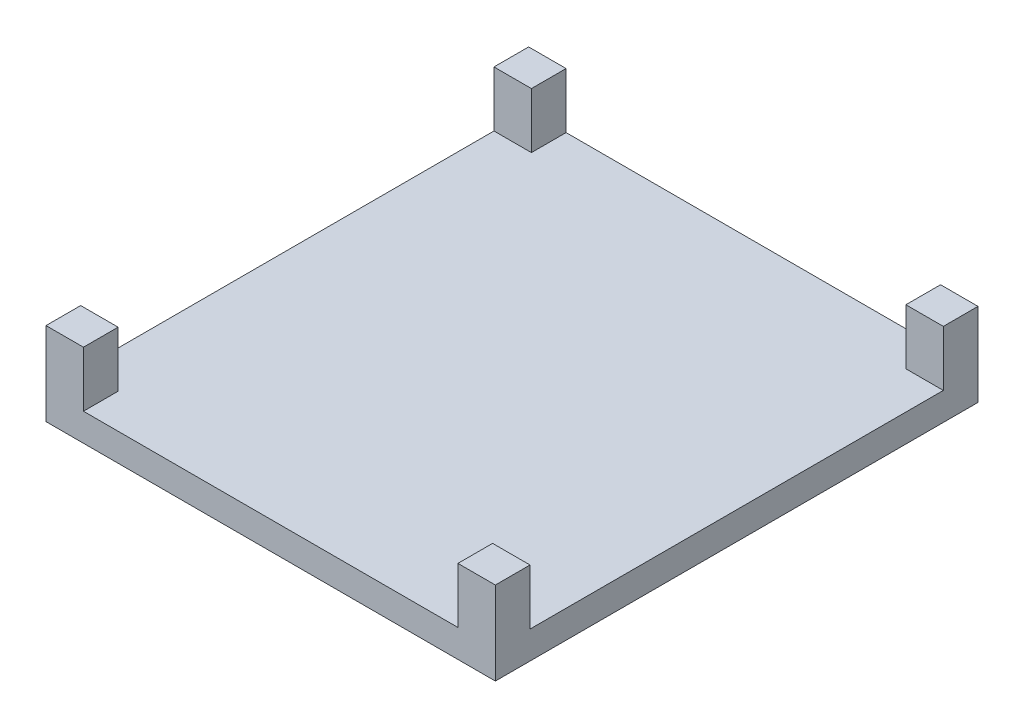
ISO-10303-21;
HEADER;
FILE_DESCRIPTION(('STEP AP214'),'2;1');
FILE_NAME('part.step','',(''),(''),'','','');
FILE_SCHEMA(('AUTOMOTIVE_DESIGN { 1 0 10303 214 1 1 1 1 }'));
ENDSEC;
DATA;
#1=APPLICATION_CONTEXT('core data for automotive mechanical design processes');
#2=APPLICATION_PROTOCOL_DEFINITION('international standard','automotive_design',2000,#1);
#3=PRODUCT_CONTEXT('',#1,'mechanical');
#4=PRODUCT('Part','Part','',(#3));
#5=PRODUCT_RELATED_PRODUCT_CATEGORY('part','',(#4));
#6=PRODUCT_DEFINITION_FORMATION('','',#4);
#7=PRODUCT_DEFINITION_CONTEXT('part definition',#1,'design');
#8=PRODUCT_DEFINITION('design','',#6,#7);
#9=PRODUCT_DEFINITION_SHAPE('','',#8);
#10=(LENGTH_UNIT() NAMED_UNIT(*) SI_UNIT(.MILLI.,.METRE.));
#11=(NAMED_UNIT(*) PLANE_ANGLE_UNIT() SI_UNIT($,.RADIAN.));
#12=(NAMED_UNIT(*) SI_UNIT($,.STERADIAN.) SOLID_ANGLE_UNIT());
#13=UNCERTAINTY_MEASURE_WITH_UNIT(LENGTH_MEASURE(1.E-05),#10,'distance_accuracy_value','');
#14=(GEOMETRIC_REPRESENTATION_CONTEXT(3) GLOBAL_UNCERTAINTY_ASSIGNED_CONTEXT((#13)) GLOBAL_UNIT_ASSIGNED_CONTEXT((#10,
#11,#12)) REPRESENTATION_CONTEXT('',''));
#15=CARTESIAN_POINT('',(0.,0.,0.));
#16=DIRECTION('',(0.,0.,1.));
#17=DIRECTION('',(1.,0.,0.));
#18=AXIS2_PLACEMENT_3D('',#15,#16,#17);
#19=CARTESIAN_POINT('',(0.,5.08,0.));
#20=DIRECTION('',(0.,-1.,0.));
#21=DIRECTION('',(0.,0.,-1.));
#22=AXIS2_PLACEMENT_3D('',#19,#20,#21);
#23=PLANE('',#22);
#24=DIRECTION('',(0.,0.,1.));
#25=VECTOR('',#24,1.);
#26=CARTESIAN_POINT('',(34.29,5.08,-37.8460000000001));
#27=LINE('',#26,#25);
#28=CARTESIAN_POINT('',(34.29,5.08,-44.196));
#29=VERTEX_POINT('',#28);
#30=CARTESIAN_POINT('',(34.29,5.08,-37.8460000000001));
#31=VERTEX_POINT('',#30);
#32=EDGE_CURVE('E157',#29,#31,#27,.T.);
#33=ORIENTED_EDGE('',*,*,#32,.F.);
#34=DIRECTION('',(1.,0.,0.));
#35=VECTOR('',#34,1.);
#36=CARTESIAN_POINT('',(-41.148,5.08,-44.196));
#37=LINE('',#36,#35);
#38=CARTESIAN_POINT('',(-34.29,5.08,-44.196));
#39=VERTEX_POINT('',#38);
#40=EDGE_CURVE('E167',#39,#29,#37,.T.);
#41=ORIENTED_EDGE('',*,*,#40,.F.);
#42=DIRECTION('',(0.,0.,-1.));
#43=VECTOR('',#42,1.);
#44=CARTESIAN_POINT('',(-34.29,5.08,-37.8460000000001));
#45=LINE('',#44,#43);
#46=CARTESIAN_POINT('',(-34.29,5.08,-37.8460000000001));
#47=VERTEX_POINT('',#46);
#48=EDGE_CURVE('E240',#47,#39,#45,.T.);
#49=ORIENTED_EDGE('',*,*,#48,.F.);
#50=DIRECTION('',(1.,0.,0.));
#51=VECTOR('',#50,1.);
#52=CARTESIAN_POINT('',(-34.29,5.08,-37.8460000000001));
#53=LINE('',#52,#51);
#54=CARTESIAN_POINT('',(-41.148,5.08,-37.8460000000001));
#55=VERTEX_POINT('',#54);
#56=EDGE_CURVE('E247',#55,#47,#53,.T.);
#57=ORIENTED_EDGE('',*,*,#56,.F.);
#58=DIRECTION('',(0.,0.,1.));
#59=VECTOR('',#58,1.);
#60=CARTESIAN_POINT('',(-41.148,5.08,-44.196));
#61=LINE('',#60,#59);
#62=CARTESIAN_POINT('',(-41.148,5.08,37.846));
#63=VERTEX_POINT('',#62);
#64=EDGE_CURVE('E179',#55,#63,#61,.T.);
#65=ORIENTED_EDGE('',*,*,#64,.T.);
#66=DIRECTION('',(-1.,0.,0.));
#67=VECTOR('',#66,1.);
#68=CARTESIAN_POINT('',(-34.29,5.08,37.846));
#69=LINE('',#68,#67);
#70=CARTESIAN_POINT('',(-34.29,5.08,37.846));
#71=VERTEX_POINT('',#70);
#72=EDGE_CURVE('E56',#71,#63,#69,.T.);
#73=ORIENTED_EDGE('',*,*,#72,.F.);
#74=DIRECTION('',(0.,0.,-1.));
#75=VECTOR('',#74,1.);
#76=CARTESIAN_POINT('',(-34.29,5.08,44.1959999999999));
#77=LINE('',#76,#75);
#78=CARTESIAN_POINT('',(-34.29,5.08,44.196));
#79=VERTEX_POINT('',#78);
#80=EDGE_CURVE('E60',#79,#71,#77,.T.);
#81=ORIENTED_EDGE('',*,*,#80,.F.);
#82=DIRECTION('',(1.,0.,0.));
#83=VECTOR('',#82,1.);
#84=CARTESIAN_POINT('',(-41.148,5.08,44.196));
#85=LINE('',#84,#83);
#86=CARTESIAN_POINT('',(34.29,5.08,44.1959999999999));
#87=VERTEX_POINT('',#86);
#88=EDGE_CURVE('E184',#79,#87,#85,.T.);
#89=ORIENTED_EDGE('',*,*,#88,.T.);
#90=DIRECTION('',(0.,0.,1.));
#91=VECTOR('',#90,1.);
#92=CARTESIAN_POINT('',(34.29,5.08,44.1959999999999));
#93=LINE('',#92,#91);
#94=CARTESIAN_POINT('',(34.29,5.08,37.846));
#95=VERTEX_POINT('',#94);
#96=EDGE_CURVE('E259',#95,#87,#93,.T.);
#97=ORIENTED_EDGE('',*,*,#96,.F.);
#98=DIRECTION('',(-1.,0.,0.));
#99=VECTOR('',#98,1.);
#100=CARTESIAN_POINT('',(34.29,5.08,37.846));
#101=LINE('',#100,#99);
#102=CARTESIAN_POINT('',(41.148,5.08,37.846));
#103=VERTEX_POINT('',#102);
#104=EDGE_CURVE('E444',#103,#95,#101,.T.);
#105=ORIENTED_EDGE('',*,*,#104,.F.);
#106=DIRECTION('',(0.,0.,1.));
#107=VECTOR('',#106,1.);
#108=CARTESIAN_POINT('',(41.148,5.08,-44.196));
#109=LINE('',#108,#107);
#110=CARTESIAN_POINT('',(41.148,5.08,-37.8460000000001));
#111=VERTEX_POINT('',#110);
#112=EDGE_CURVE('E180',#111,#103,#109,.T.);
#113=ORIENTED_EDGE('',*,*,#112,.F.);
#114=DIRECTION('',(1.,0.,0.));
#115=VECTOR('',#114,1.);
#116=CARTESIAN_POINT('',(34.29,5.08,-37.8460000000001));
#117=LINE('',#116,#115);
#118=EDGE_CURVE('E170',#31,#111,#117,.T.);
#119=ORIENTED_EDGE('',*,*,#118,.F.);
#120=EDGE_LOOP('',(#33,#41,#49,#57,#65,#73,#81,#89,#97,#105,#113,#119));
#121=FACE_BOUND('',#120,.T.);
#122=ADVANCED_FACE('F41',(#121),#23,.F.);
#123=CARTESIAN_POINT('',(-41.148,5.08,44.196));
#124=DIRECTION('',(0.,0.,-1.));
#125=DIRECTION('',(-1.,0.,0.));
#126=AXIS2_PLACEMENT_3D('',#123,#124,#125);
#127=PLANE('',#126);
#128=DIRECTION('',(1.,0.,0.));
#129=VECTOR('',#128,1.);
#130=CARTESIAN_POINT('',(-41.148,0.,44.196));
#131=LINE('',#130,#129);
#132=CARTESIAN_POINT('',(-41.148,0.,44.196));
#133=VERTEX_POINT('',#132);
#134=CARTESIAN_POINT('',(41.148,0.,44.196));
#135=VERTEX_POINT('',#134);
#136=EDGE_CURVE('E188',#133,#135,#131,.T.);
#137=ORIENTED_EDGE('',*,*,#136,.T.);
#138=DIRECTION('',(0.,-1.,0.));
#139=VECTOR('',#138,1.);
#140=CARTESIAN_POINT('',(41.148,5.08,44.196));
#141=LINE('',#140,#139);
#142=CARTESIAN_POINT('',(41.148,15.24,44.1959999999999));
#143=VERTEX_POINT('',#142);
#144=EDGE_CURVE('E11',#143,#135,#141,.T.);
#145=ORIENTED_EDGE('',*,*,#144,.F.);
#146=DIRECTION('',(1.,0.,0.));
#147=VECTOR('',#146,1.);
#148=CARTESIAN_POINT('',(34.29,15.24,44.1959999999999));
#149=LINE('',#148,#147);
#150=CARTESIAN_POINT('',(34.29,15.24,44.1959999999999));
#151=VERTEX_POINT('',#150);
#152=EDGE_CURVE('E451',#151,#143,#149,.T.);
#153=ORIENTED_EDGE('',*,*,#152,.F.);
#154=DIRECTION('',(0.,-1.,0.));
#155=VECTOR('',#154,1.);
#156=CARTESIAN_POINT('',(34.29,15.24,44.1959999999999));
#157=LINE('',#156,#155);
#158=EDGE_CURVE('E171',#151,#87,#157,.T.);
#159=ORIENTED_EDGE('',*,*,#158,.T.);
#160=ORIENTED_EDGE('',*,*,#88,.F.);
#161=DIRECTION('',(0.,-1.,0.));
#162=VECTOR('',#161,1.);
#163=CARTESIAN_POINT('',(-34.29,15.24,44.1959999999999));
#164=LINE('',#163,#162);
#165=CARTESIAN_POINT('',(-34.29,15.24,44.1959999999999));
#166=VERTEX_POINT('',#165);
#167=EDGE_CURVE('E222',#166,#79,#164,.T.);
#168=ORIENTED_EDGE('',*,*,#167,.F.);
#169=DIRECTION('',(1.,0.,0.));
#170=VECTOR('',#169,1.);
#171=CARTESIAN_POINT('',(-34.29,15.24,44.1959999999999));
#172=LINE('',#171,#170);
#173=CARTESIAN_POINT('',(-41.148,15.24,44.1959999999999));
#174=VERTEX_POINT('',#173);
#175=EDGE_CURVE('E220',#174,#166,#172,.T.);
#176=ORIENTED_EDGE('',*,*,#175,.F.);
#177=DIRECTION('',(0.,-1.,0.));
#178=VECTOR('',#177,1.);
#179=CARTESIAN_POINT('',(-41.148,5.08,44.196));
#180=LINE('',#179,#178);
#181=EDGE_CURVE('E182',#174,#133,#180,.T.);
#182=ORIENTED_EDGE('',*,*,#181,.T.);
#183=EDGE_LOOP('',(#137,#145,#153,#159,#160,#168,#176,#182));
#184=FACE_BOUND('',#183,.T.);
#185=ADVANCED_FACE('F43',(#184),#127,.F.);
#186=CARTESIAN_POINT('',(41.148,5.08,-44.196));
#187=DIRECTION('',(1.,0.,0.));
#188=DIRECTION('',(0.,0.,-1.));
#189=AXIS2_PLACEMENT_3D('',#186,#187,#188);
#190=PLANE('',#189);
#191=DIRECTION('',(0.,0.,1.));
#192=VECTOR('',#191,1.);
#193=CARTESIAN_POINT('',(41.148,0.,-44.196));
#194=LINE('',#193,#192);
#195=CARTESIAN_POINT('',(41.148,0.,-44.196));
#196=VERTEX_POINT('',#195);
#197=EDGE_CURVE('E191',#196,#135,#194,.T.);
#198=ORIENTED_EDGE('',*,*,#197,.F.);
#199=DIRECTION('',(0.,-1.,0.));
#200=VECTOR('',#199,1.);
#201=CARTESIAN_POINT('',(41.148,5.08,-44.196));
#202=LINE('',#201,#200);
#203=CARTESIAN_POINT('',(41.148,15.24,-44.196));
#204=VERTEX_POINT('',#203);
#205=EDGE_CURVE('E49',#204,#196,#202,.T.);
#206=ORIENTED_EDGE('',*,*,#205,.F.);
#207=DIRECTION('',(0.,0.,-1.));
#208=VECTOR('',#207,1.);
#209=CARTESIAN_POINT('',(41.148,15.24,-37.8460000000001));
#210=LINE('',#209,#208);
#211=CARTESIAN_POINT('',(41.148,15.24,-37.8460000000001));
#212=VERTEX_POINT('',#211);
#213=EDGE_CURVE('E433',#212,#204,#210,.T.);
#214=ORIENTED_EDGE('',*,*,#213,.F.);
#215=DIRECTION('',(0.,-1.,0.));
#216=VECTOR('',#215,1.);
#217=CARTESIAN_POINT('',(41.148,15.24,-37.8460000000001));
#218=LINE('',#217,#216);
#219=EDGE_CURVE('E165',#212,#111,#218,.T.);
#220=ORIENTED_EDGE('',*,*,#219,.T.);
#221=ORIENTED_EDGE('',*,*,#112,.T.);
#222=DIRECTION('',(0.,-1.,0.));
#223=VECTOR('',#222,1.);
#224=CARTESIAN_POINT('',(41.148,15.24,37.846));
#225=LINE('',#224,#223);
#226=CARTESIAN_POINT('',(41.148,15.24,37.846));
#227=VERTEX_POINT('',#226);
#228=EDGE_CURVE('E437',#227,#103,#225,.T.);
#229=ORIENTED_EDGE('',*,*,#228,.F.);
#230=DIRECTION('',(0.,0.,-1.));
#231=VECTOR('',#230,1.);
#232=CARTESIAN_POINT('',(41.148,15.24,44.1959999999999));
#233=LINE('',#232,#231);
#234=EDGE_CURVE('E449',#143,#227,#233,.T.);
#235=ORIENTED_EDGE('',*,*,#234,.F.);
#236=ORIENTED_EDGE('',*,*,#144,.T.);
#237=EDGE_LOOP('',(#198,#206,#214,#220,#221,#229,#235,#236));
#238=FACE_BOUND('',#237,.T.);
#239=ADVANCED_FACE('F207',(#238),#190,.T.);
#240=CARTESIAN_POINT('',(-41.148,5.08,-44.196));
#241=DIRECTION('',(0.,0.,-1.));
#242=DIRECTION('',(-1.,0.,0.));
#243=AXIS2_PLACEMENT_3D('',#240,#241,#242);
#244=PLANE('',#243);
#245=DIRECTION('',(1.,0.,0.));
#246=VECTOR('',#245,1.);
#247=CARTESIAN_POINT('',(-41.148,0.,-44.196));
#248=LINE('',#247,#246);
#249=CARTESIAN_POINT('',(-41.148,0.,-44.196));
#250=VERTEX_POINT('',#249);
#251=EDGE_CURVE('E195',#250,#196,#248,.T.);
#252=ORIENTED_EDGE('',*,*,#251,.F.);
#253=DIRECTION('',(0.,-1.,0.));
#254=VECTOR('',#253,1.);
#255=CARTESIAN_POINT('',(-41.148,5.08,-44.196));
#256=LINE('',#255,#254);
#257=CARTESIAN_POINT('',(-41.148,15.24,-44.196));
#258=VERTEX_POINT('',#257);
#259=EDGE_CURVE('E202',#258,#250,#256,.T.);
#260=ORIENTED_EDGE('',*,*,#259,.F.);
#261=DIRECTION('',(-1.,0.,0.));
#262=VECTOR('',#261,1.);
#263=CARTESIAN_POINT('',(-34.29,15.24,-44.196));
#264=LINE('',#263,#262);
#265=CARTESIAN_POINT('',(-34.29,15.24,-44.196));
#266=VERTEX_POINT('',#265);
#267=EDGE_CURVE('E244',#266,#258,#264,.T.);
#268=ORIENTED_EDGE('',*,*,#267,.F.);
#269=DIRECTION('',(0.,-1.,0.));
#270=VECTOR('',#269,1.);
#271=CARTESIAN_POINT('',(-34.29,15.24,-44.196));
#272=LINE('',#271,#270);
#273=EDGE_CURVE('E178',#266,#39,#272,.T.);
#274=ORIENTED_EDGE('',*,*,#273,.T.);
#275=ORIENTED_EDGE('',*,*,#40,.T.);
#276=DIRECTION('',(0.,-1.,0.));
#277=VECTOR('',#276,1.);
#278=CARTESIAN_POINT('',(34.29,15.24,-44.196));
#279=LINE('',#278,#277);
#280=CARTESIAN_POINT('',(34.29,15.24,-44.196));
#281=VERTEX_POINT('',#280);
#282=EDGE_CURVE('E153',#281,#29,#279,.T.);
#283=ORIENTED_EDGE('',*,*,#282,.F.);
#284=DIRECTION('',(-1.,0.,0.));
#285=VECTOR('',#284,1.);
#286=CARTESIAN_POINT('',(34.29,15.24,-44.196));
#287=LINE('',#286,#285);
#288=EDGE_CURVE('E164',#204,#281,#287,.T.);
#289=ORIENTED_EDGE('',*,*,#288,.F.);
#290=ORIENTED_EDGE('',*,*,#205,.T.);
#291=EDGE_LOOP('',(#252,#260,#268,#274,#275,#283,#289,#290));
#292=FACE_BOUND('',#291,.T.);
#293=ADVANCED_FACE('F175',(#292),#244,.T.);
#294=CARTESIAN_POINT('',(-41.148,5.08,-44.196));
#295=DIRECTION('',(1.,0.,0.));
#296=DIRECTION('',(0.,0.,-1.));
#297=AXIS2_PLACEMENT_3D('',#294,#295,#296);
#298=PLANE('',#297);
#299=DIRECTION('',(0.,0.,1.));
#300=VECTOR('',#299,1.);
#301=CARTESIAN_POINT('',(-41.148,0.,-44.196));
#302=LINE('',#301,#300);
#303=EDGE_CURVE('E198',#250,#133,#302,.T.);
#304=ORIENTED_EDGE('',*,*,#303,.T.);
#305=ORIENTED_EDGE('',*,*,#181,.F.);
#306=DIRECTION('',(0.,0.,1.));
#307=VECTOR('',#306,1.);
#308=CARTESIAN_POINT('',(-41.148,15.24,44.1959999999999));
#309=LINE('',#308,#307);
#310=CARTESIAN_POINT('',(-41.148,15.24,37.846));
#311=VERTEX_POINT('',#310);
#312=EDGE_CURVE('E225',#311,#174,#309,.T.);
#313=ORIENTED_EDGE('',*,*,#312,.F.);
#314=DIRECTION('',(0.,-1.,0.));
#315=VECTOR('',#314,1.);
#316=CARTESIAN_POINT('',(-41.148,15.24,37.846));
#317=LINE('',#316,#315);
#318=EDGE_CURVE('E265',#311,#63,#317,.T.);
#319=ORIENTED_EDGE('',*,*,#318,.T.);
#320=ORIENTED_EDGE('',*,*,#64,.F.);
#321=DIRECTION('',(0.,-1.,0.));
#322=VECTOR('',#321,1.);
#323=CARTESIAN_POINT('',(-41.148,15.24,-37.8460000000001));
#324=LINE('',#323,#322);
#325=CARTESIAN_POINT('',(-41.148,15.24,-37.8460000000001));
#326=VERTEX_POINT('',#325);
#327=EDGE_CURVE('E192',#326,#55,#324,.T.);
#328=ORIENTED_EDGE('',*,*,#327,.F.);
#329=DIRECTION('',(0.,0.,1.));
#330=VECTOR('',#329,1.);
#331=CARTESIAN_POINT('',(-41.148,15.24,-37.8460000000001));
#332=LINE('',#331,#330);
#333=EDGE_CURVE('E236',#258,#326,#332,.T.);
#334=ORIENTED_EDGE('',*,*,#333,.F.);
#335=ORIENTED_EDGE('',*,*,#259,.T.);
#336=EDGE_LOOP('',(#304,#305,#313,#319,#320,#328,#334,#335));
#337=FACE_BOUND('',#336,.T.);
#338=ADVANCED_FACE('F214',(#337),#298,.F.);
#339=CARTESIAN_POINT('',(0.,0.,0.));
#340=DIRECTION('',(0.,-1.,0.));
#341=DIRECTION('',(0.,0.,-1.));
#342=AXIS2_PLACEMENT_3D('',#339,#340,#341);
#343=PLANE('',#342);
#344=ORIENTED_EDGE('',*,*,#136,.F.);
#345=ORIENTED_EDGE('',*,*,#303,.F.);
#346=ORIENTED_EDGE('',*,*,#251,.T.);
#347=ORIENTED_EDGE('',*,*,#197,.T.);
#348=EDGE_LOOP('',(#344,#345,#346,#347));
#349=FACE_BOUND('',#348,.T.);
#350=ADVANCED_FACE('F212',(#349),#343,.T.);
#351=CARTESIAN_POINT('',(-34.29,15.24,-37.8460000000001));
#352=DIRECTION('',(0.,0.,-1.));
#353=DIRECTION('',(-1.,0.,0.));
#354=AXIS2_PLACEMENT_3D('',#351,#352,#353);
#355=PLANE('',#354);
#356=ORIENTED_EDGE('',*,*,#56,.T.);
#357=DIRECTION('',(0.,-1.,0.));
#358=VECTOR('',#357,1.);
#359=CARTESIAN_POINT('',(-34.29,15.24,-37.8460000000001));
#360=LINE('',#359,#358);
#361=CARTESIAN_POINT('',(-34.29,15.24,-37.8460000000001));
#362=VERTEX_POINT('',#361);
#363=EDGE_CURVE('E252',#362,#47,#360,.T.);
#364=ORIENTED_EDGE('',*,*,#363,.F.);
#365=DIRECTION('',(1.,0.,0.));
#366=VECTOR('',#365,1.);
#367=CARTESIAN_POINT('',(-34.29,15.24,-37.8460000000001));
#368=LINE('',#367,#366);
#369=EDGE_CURVE('E239',#326,#362,#368,.T.);
#370=ORIENTED_EDGE('',*,*,#369,.F.);
#371=ORIENTED_EDGE('',*,*,#327,.T.);
#372=EDGE_LOOP('',(#356,#364,#370,#371));
#373=FACE_BOUND('',#372,.T.);
#374=ADVANCED_FACE('F280',(#373),#355,.F.);
#375=CARTESIAN_POINT('',(-34.29,15.24,-37.8460000000001));
#376=DIRECTION('',(-1.,0.,0.));
#377=DIRECTION('',(0.,0.,1.));
#378=AXIS2_PLACEMENT_3D('',#375,#376,#377);
#379=PLANE('',#378);
#380=ORIENTED_EDGE('',*,*,#48,.T.);
#381=ORIENTED_EDGE('',*,*,#273,.F.);
#382=DIRECTION('',(0.,0.,-1.));
#383=VECTOR('',#382,1.);
#384=CARTESIAN_POINT('',(-34.29,15.24,-37.8460000000001));
#385=LINE('',#384,#383);
#386=EDGE_CURVE('E242',#362,#266,#385,.T.);
#387=ORIENTED_EDGE('',*,*,#386,.F.);
#388=ORIENTED_EDGE('',*,*,#363,.T.);
#389=EDGE_LOOP('',(#380,#381,#387,#388));
#390=FACE_BOUND('',#389,.T.);
#391=ADVANCED_FACE('F286',(#390),#379,.F.);
#392=CARTESIAN_POINT('',(0.,15.24,0.));
#393=DIRECTION('',(0.,1.,0.));
#394=DIRECTION('',(0.,0.,1.));
#395=AXIS2_PLACEMENT_3D('',#392,#393,#394);
#396=PLANE('',#395);
#397=ORIENTED_EDGE('',*,*,#333,.T.);
#398=ORIENTED_EDGE('',*,*,#369,.T.);
#399=ORIENTED_EDGE('',*,*,#386,.T.);
#400=ORIENTED_EDGE('',*,*,#267,.T.);
#401=EDGE_LOOP('',(#397,#398,#399,#400));
#402=FACE_BOUND('',#401,.T.);
#403=ADVANCED_FACE('F284',(#402),#396,.T.);
#404=CARTESIAN_POINT('',(-34.29,15.24,37.846));
#405=DIRECTION('',(0.,0.,1.));
#406=DIRECTION('',(1.,0.,0.));
#407=AXIS2_PLACEMENT_3D('',#404,#405,#406);
#408=PLANE('',#407);
#409=ORIENTED_EDGE('',*,*,#72,.T.);
#410=ORIENTED_EDGE('',*,*,#318,.F.);
#411=DIRECTION('',(-1.,0.,0.));
#412=VECTOR('',#411,1.);
#413=CARTESIAN_POINT('',(-34.29,15.24,37.846));
#414=LINE('',#413,#412);
#415=CARTESIAN_POINT('',(-34.29,15.24,37.846));
#416=VERTEX_POINT('',#415);
#417=EDGE_CURVE('E228',#416,#311,#414,.T.);
#418=ORIENTED_EDGE('',*,*,#417,.F.);
#419=DIRECTION('',(0.,-1.,0.));
#420=VECTOR('',#419,1.);
#421=CARTESIAN_POINT('',(-34.29,15.24,37.846));
#422=LINE('',#421,#420);
#423=EDGE_CURVE('E230',#416,#71,#422,.T.);
#424=ORIENTED_EDGE('',*,*,#423,.T.);
#425=EDGE_LOOP('',(#409,#410,#418,#424));
#426=FACE_BOUND('',#425,.T.);
#427=ADVANCED_FACE('F274',(#426),#408,.F.);
#428=CARTESIAN_POINT('',(-34.29,15.24,44.1959999999999));
#429=DIRECTION('',(-1.,0.,0.));
#430=DIRECTION('',(0.,0.,1.));
#431=AXIS2_PLACEMENT_3D('',#428,#429,#430);
#432=PLANE('',#431);
#433=ORIENTED_EDGE('',*,*,#80,.T.);
#434=ORIENTED_EDGE('',*,*,#423,.F.);
#435=DIRECTION('',(0.,0.,-1.));
#436=VECTOR('',#435,1.);
#437=CARTESIAN_POINT('',(-34.29,15.24,44.1959999999999));
#438=LINE('',#437,#436);
#439=EDGE_CURVE('E226',#166,#416,#438,.T.);
#440=ORIENTED_EDGE('',*,*,#439,.F.);
#441=ORIENTED_EDGE('',*,*,#167,.T.);
#442=EDGE_LOOP('',(#433,#434,#440,#441));
#443=FACE_BOUND('',#442,.T.);
#444=ADVANCED_FACE('F262',(#443),#432,.F.);
#445=CARTESIAN_POINT('',(0.,15.24,0.));
#446=DIRECTION('',(0.,-1.,0.));
#447=DIRECTION('',(0.,0.,-1.));
#448=AXIS2_PLACEMENT_3D('',#445,#446,#447);
#449=PLANE('',#448);
#450=ORIENTED_EDGE('',*,*,#417,.T.);
#451=ORIENTED_EDGE('',*,*,#312,.T.);
#452=ORIENTED_EDGE('',*,*,#175,.T.);
#453=ORIENTED_EDGE('',*,*,#439,.T.);
#454=EDGE_LOOP('',(#450,#451,#452,#453));
#455=FACE_BOUND('',#454,.T.);
#456=ADVANCED_FACE('F276',(#455),#449,.F.);
#457=CARTESIAN_POINT('',(34.29,15.24,44.1959999999999));
#458=DIRECTION('',(1.,0.,0.));
#459=DIRECTION('',(0.,0.,-1.));
#460=AXIS2_PLACEMENT_3D('',#457,#458,#459);
#461=PLANE('',#460);
#462=ORIENTED_EDGE('',*,*,#96,.T.);
#463=ORIENTED_EDGE('',*,*,#158,.F.);
#464=DIRECTION('',(0.,0.,1.));
#465=VECTOR('',#464,1.);
#466=CARTESIAN_POINT('',(34.29,15.24,44.1959999999999));
#467=LINE('',#466,#465);
#468=CARTESIAN_POINT('',(34.29,15.24,37.846));
#469=VERTEX_POINT('',#468);
#470=EDGE_CURVE('E446',#469,#151,#467,.T.);
#471=ORIENTED_EDGE('',*,*,#470,.F.);
#472=DIRECTION('',(0.,-1.,0.));
#473=VECTOR('',#472,1.);
#474=CARTESIAN_POINT('',(34.29,15.24,37.846));
#475=LINE('',#474,#473);
#476=EDGE_CURVE('E440',#469,#95,#475,.T.);
#477=ORIENTED_EDGE('',*,*,#476,.T.);
#478=EDGE_LOOP('',(#462,#463,#471,#477));
#479=FACE_BOUND('',#478,.T.);
#480=ADVANCED_FACE('F363',(#479),#461,.F.);
#481=CARTESIAN_POINT('',(34.29,15.24,37.846));
#482=DIRECTION('',(0.,0.,1.));
#483=DIRECTION('',(1.,0.,0.));
#484=AXIS2_PLACEMENT_3D('',#481,#482,#483);
#485=PLANE('',#484);
#486=ORIENTED_EDGE('',*,*,#104,.T.);
#487=ORIENTED_EDGE('',*,*,#476,.F.);
#488=DIRECTION('',(-1.,0.,0.));
#489=VECTOR('',#488,1.);
#490=CARTESIAN_POINT('',(34.29,15.24,37.846));
#491=LINE('',#490,#489);
#492=EDGE_CURVE('E443',#227,#469,#491,.T.);
#493=ORIENTED_EDGE('',*,*,#492,.F.);
#494=ORIENTED_EDGE('',*,*,#228,.T.);
#495=EDGE_LOOP('',(#486,#487,#493,#494));
#496=FACE_BOUND('',#495,.T.);
#497=ADVANCED_FACE('F372',(#496),#485,.F.);
#498=CARTESIAN_POINT('',(0.,15.24,0.));
#499=DIRECTION('',(0.,-1.,0.));
#500=DIRECTION('',(0.,0.,-1.));
#501=AXIS2_PLACEMENT_3D('',#498,#499,#500);
#502=PLANE('',#501);
#503=ORIENTED_EDGE('',*,*,#470,.T.);
#504=ORIENTED_EDGE('',*,*,#152,.T.);
#505=ORIENTED_EDGE('',*,*,#234,.T.);
#506=ORIENTED_EDGE('',*,*,#492,.T.);
#507=EDGE_LOOP('',(#503,#504,#505,#506));
#508=FACE_BOUND('',#507,.T.);
#509=ADVANCED_FACE('F382',(#508),#502,.F.);
#510=CARTESIAN_POINT('',(34.29,15.24,-37.8460000000001));
#511=DIRECTION('',(1.,0.,0.));
#512=DIRECTION('',(0.,0.,-1.));
#513=AXIS2_PLACEMENT_3D('',#510,#511,#512);
#514=PLANE('',#513);
#515=ORIENTED_EDGE('',*,*,#32,.T.);
#516=DIRECTION('',(0.,-1.,0.));
#517=VECTOR('',#516,1.);
#518=CARTESIAN_POINT('',(34.29,15.24,-37.8460000000001));
#519=LINE('',#518,#517);
#520=CARTESIAN_POINT('',(34.29,15.24,-37.8460000000001));
#521=VERTEX_POINT('',#520);
#522=EDGE_CURVE('E426',#521,#31,#519,.T.);
#523=ORIENTED_EDGE('',*,*,#522,.F.);
#524=DIRECTION('',(0.,0.,1.));
#525=VECTOR('',#524,1.);
#526=CARTESIAN_POINT('',(34.29,15.24,-37.8460000000001));
#527=LINE('',#526,#525);
#528=EDGE_CURVE('E160',#281,#521,#527,.T.);
#529=ORIENTED_EDGE('',*,*,#528,.F.);
#530=ORIENTED_EDGE('',*,*,#282,.T.);
#531=EDGE_LOOP('',(#515,#523,#529,#530));
#532=FACE_BOUND('',#531,.T.);
#533=ADVANCED_FACE('F155',(#532),#514,.F.);
#534=CARTESIAN_POINT('',(34.29,15.24,-37.8460000000001));
#535=DIRECTION('',(0.,0.,-1.));
#536=DIRECTION('',(-1.,0.,0.));
#537=AXIS2_PLACEMENT_3D('',#534,#535,#536);
#538=PLANE('',#537);
#539=ORIENTED_EDGE('',*,*,#118,.T.);
#540=ORIENTED_EDGE('',*,*,#219,.F.);
#541=DIRECTION('',(1.,0.,0.));
#542=VECTOR('',#541,1.);
#543=CARTESIAN_POINT('',(34.29,15.24,-37.8460000000001));
#544=LINE('',#543,#542);
#545=EDGE_CURVE('E423',#521,#212,#544,.T.);
#546=ORIENTED_EDGE('',*,*,#545,.F.);
#547=ORIENTED_EDGE('',*,*,#522,.T.);
#548=EDGE_LOOP('',(#539,#540,#546,#547));
#549=FACE_BOUND('',#548,.T.);
#550=ADVANCED_FACE('F401',(#549),#538,.F.);
#551=CARTESIAN_POINT('',(0.,15.24,0.));
#552=DIRECTION('',(0.,-1.,0.));
#553=DIRECTION('',(0.,0.,-1.));
#554=AXIS2_PLACEMENT_3D('',#551,#552,#553);
#555=PLANE('',#554);
#556=ORIENTED_EDGE('',*,*,#528,.T.);
#557=ORIENTED_EDGE('',*,*,#545,.T.);
#558=ORIENTED_EDGE('',*,*,#213,.T.);
#559=ORIENTED_EDGE('',*,*,#288,.T.);
#560=EDGE_LOOP('',(#556,#557,#558,#559));
#561=FACE_BOUND('',#560,.T.);
#562=ADVANCED_FACE('F410',(#561),#555,.F.);
#563=CLOSED_SHELL('',(#122,#185,#239,#293,#338,#350,#374,#391,#403,#427,#444,#456,#480,#497,
#509,#533,#550,#562));
#564=MANIFOLD_SOLID_BREP('B2',#563);
#565=ADVANCED_BREP_SHAPE_REPRESENTATION('',(#18,#564),#14);
#566=SHAPE_DEFINITION_REPRESENTATION(#9,#565);
ENDSEC;
END-ISO-10303-21;
